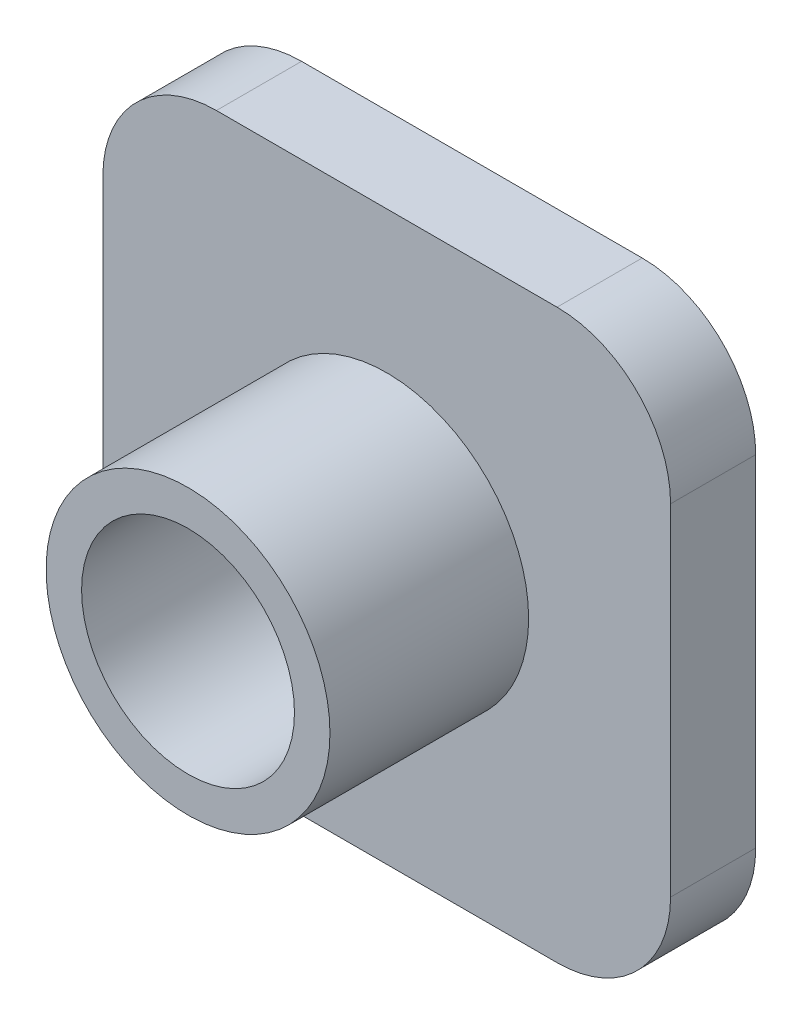
ISO-10303-21;
HEADER;
FILE_DESCRIPTION(('STEP AP214'),'2;1');
FILE_NAME('part.step','',(''),(''),'','','');
FILE_SCHEMA(('AUTOMOTIVE_DESIGN { 1 0 10303 214 1 1 1 1 }'));
ENDSEC;
DATA;
#1=APPLICATION_CONTEXT('core data for automotive mechanical design processes');
#2=APPLICATION_PROTOCOL_DEFINITION('international standard','automotive_design',2000,#1);
#3=PRODUCT_CONTEXT('',#1,'mechanical');
#4=PRODUCT('Part','Part','',(#3));
#5=PRODUCT_RELATED_PRODUCT_CATEGORY('part','',(#4));
#6=PRODUCT_DEFINITION_FORMATION('','',#4);
#7=PRODUCT_DEFINITION_CONTEXT('part definition',#1,'design');
#8=PRODUCT_DEFINITION('design','',#6,#7);
#9=PRODUCT_DEFINITION_SHAPE('','',#8);
#10=(LENGTH_UNIT() NAMED_UNIT(*) SI_UNIT(.MILLI.,.METRE.));
#11=(NAMED_UNIT(*) PLANE_ANGLE_UNIT() SI_UNIT($,.RADIAN.));
#12=(NAMED_UNIT(*) SI_UNIT($,.STERADIAN.) SOLID_ANGLE_UNIT());
#13=UNCERTAINTY_MEASURE_WITH_UNIT(LENGTH_MEASURE(1.E-05),#10,'distance_accuracy_value','');
#14=(GEOMETRIC_REPRESENTATION_CONTEXT(3) GLOBAL_UNCERTAINTY_ASSIGNED_CONTEXT((#13)) GLOBAL_UNIT_ASSIGNED_CONTEXT((#10,
#11,#12)) REPRESENTATION_CONTEXT('',''));
#15=CARTESIAN_POINT('',(0.,0.,0.));
#16=DIRECTION('',(0.,0.,1.));
#17=DIRECTION('',(1.,0.,0.));
#18=AXIS2_PLACEMENT_3D('',#15,#16,#17);
#19=CARTESIAN_POINT('',(-123.000000000001,-48.0000000000001,20.));
#20=DIRECTION('',(0.,0.,1.));
#21=DIRECTION('',(1.,0.,0.));
#22=AXIS2_PLACEMENT_3D('',#19,#20,#21);
#23=PLANE('',#22);
#24=CARTESIAN_POINT('',(-123.000000000001,-48.0000000000001,20.));
#25=DIRECTION('',(0.,0.,1.));
#26=DIRECTION('',(1.,0.,0.));
#27=AXIS2_PLACEMENT_3D('',#24,#25,#26);
#28=CIRCLE('',#27,9.99999999999999);
#29=CARTESIAN_POINT('',(-113.000000000001,-48.0000000000001,20.));
#30=VERTEX_POINT('',#29);
#31=EDGE_CURVE('E11',#30,#30,#28,.T.);
#32=ORIENTED_EDGE('',*,*,#31,.T.);
#33=EDGE_LOOP('',(#32));
#34=FACE_BOUND('',#33,.T.);
#35=CARTESIAN_POINT('',(-123.000000000001,-48.0000000000001,20.));
#36=DIRECTION('',(0.,0.,1.));
#37=DIRECTION('',(1.,0.,0.));
#38=AXIS2_PLACEMENT_3D('',#35,#36,#37);
#39=CIRCLE('',#38,7.5);
#40=CARTESIAN_POINT('',(-115.500000000001,-48.0000000000001,20.));
#41=VERTEX_POINT('',#40);
#42=EDGE_CURVE('E42',#41,#41,#39,.T.);
#43=ORIENTED_EDGE('',*,*,#42,.F.);
#44=EDGE_LOOP('',(#43));
#45=FACE_BOUND('',#44,.T.);
#46=ADVANCED_FACE('F33',(#34,#45),#23,.T.);
#47=CARTESIAN_POINT('',(-123.000000000001,-48.0000000000001,0.));
#48=DIRECTION('',(0.,0.,1.));
#49=DIRECTION('',(1.,0.,0.));
#50=AXIS2_PLACEMENT_3D('',#47,#48,#49);
#51=PLANE('',#50);
#52=CARTESIAN_POINT('',(-123.000000000001,-48.0000000000001,0.));
#53=DIRECTION('',(0.,0.,1.));
#54=DIRECTION('',(1.,0.,0.));
#55=AXIS2_PLACEMENT_3D('',#52,#53,#54);
#56=CIRCLE('',#55,7.5);
#57=CARTESIAN_POINT('',(-115.500000000001,-48.0000000000001,0.));
#58=VERTEX_POINT('',#57);
#59=EDGE_CURVE('E169',#58,#58,#56,.T.);
#60=ORIENTED_EDGE('',*,*,#59,.T.);
#61=EDGE_LOOP('',(#60));
#62=FACE_BOUND('',#61,.T.);
#63=CARTESIAN_POINT('',(-135.000000000001,-36.0000000000001,0.));
#64=DIRECTION('',(0.,0.,-1.));
#65=DIRECTION('',(1.,0.,0.));
#66=AXIS2_PLACEMENT_3D('',#63,#64,#65);
#67=CIRCLE('',#66,8.00000000000001);
#68=CARTESIAN_POINT('',(-143.000000000001,-36.0000000000001,0.));
#69=VERTEX_POINT('',#68);
#70=CARTESIAN_POINT('',(-135.000000000001,-28.0000000000001,0.));
#71=VERTEX_POINT('',#70);
#72=EDGE_CURVE('E134',#69,#71,#67,.T.);
#73=ORIENTED_EDGE('',*,*,#72,.T.);
#74=DIRECTION('',(1.,0.,0.));
#75=VECTOR('',#74,1.);
#76=CARTESIAN_POINT('',(-111.000000000001,-28.0000000000001,0.));
#77=LINE('',#76,#75);
#78=CARTESIAN_POINT('',(-111.000000000001,-28.0000000000001,0.));
#79=VERTEX_POINT('',#78);
#80=EDGE_CURVE('E137',#71,#79,#77,.T.);
#81=ORIENTED_EDGE('',*,*,#80,.T.);
#82=CARTESIAN_POINT('',(-111.000000000001,-36.0000000000001,0.));
#83=DIRECTION('',(0.,0.,-1.));
#84=DIRECTION('',(-1.,0.,0.));
#85=AXIS2_PLACEMENT_3D('',#82,#83,#84);
#86=CIRCLE('',#85,8.00000000000001);
#87=CARTESIAN_POINT('',(-103.000000000001,-36.0000000000001,0.));
#88=VERTEX_POINT('',#87);
#89=EDGE_CURVE('E140',#79,#88,#86,.T.);
#90=ORIENTED_EDGE('',*,*,#89,.T.);
#91=DIRECTION('',(0.,-1.,0.));
#92=VECTOR('',#91,1.);
#93=CARTESIAN_POINT('',(-103.000000000001,-36.0000000000001,0.));
#94=LINE('',#93,#92);
#95=CARTESIAN_POINT('',(-103.000000000001,-60.0000000000001,0.));
#96=VERTEX_POINT('',#95);
#97=EDGE_CURVE('E143',#88,#96,#94,.T.);
#98=ORIENTED_EDGE('',*,*,#97,.T.);
#99=CARTESIAN_POINT('',(-111.000000000001,-60.0000000000001,0.));
#100=DIRECTION('',(0.,0.,-1.));
#101=DIRECTION('',(-1.,0.,0.));
#102=AXIS2_PLACEMENT_3D('',#99,#100,#101);
#103=CIRCLE('',#102,7.99999999999999);
#104=CARTESIAN_POINT('',(-111.000000000001,-68.0000000000001,0.));
#105=VERTEX_POINT('',#104);
#106=EDGE_CURVE('E146',#96,#105,#103,.T.);
#107=ORIENTED_EDGE('',*,*,#106,.T.);
#108=DIRECTION('',(-1.,0.,0.));
#109=VECTOR('',#108,1.);
#110=CARTESIAN_POINT('',(-111.000000000001,-68.0000000000001,0.));
#111=LINE('',#110,#109);
#112=CARTESIAN_POINT('',(-135.000000000001,-68.0000000000001,0.));
#113=VERTEX_POINT('',#112);
#114=EDGE_CURVE('E149',#105,#113,#111,.T.);
#115=ORIENTED_EDGE('',*,*,#114,.T.);
#116=CARTESIAN_POINT('',(-135.000000000001,-60.0000000000001,0.));
#117=DIRECTION('',(0.,0.,-1.));
#118=DIRECTION('',(-1.,0.,0.));
#119=AXIS2_PLACEMENT_3D('',#116,#117,#118);
#120=CIRCLE('',#119,8.);
#121=CARTESIAN_POINT('',(-143.000000000001,-60.0000000000001,0.));
#122=VERTEX_POINT('',#121);
#123=EDGE_CURVE('E110',#113,#122,#120,.T.);
#124=ORIENTED_EDGE('',*,*,#123,.T.);
#125=DIRECTION('',(0.,1.,0.));
#126=VECTOR('',#125,1.);
#127=CARTESIAN_POINT('',(-143.000000000001,-36.0000000000001,0.));
#128=LINE('',#127,#126);
#129=EDGE_CURVE('E152',#122,#69,#128,.T.);
#130=ORIENTED_EDGE('',*,*,#129,.T.);
#131=EDGE_LOOP('',(#73,#81,#90,#98,#107,#115,#124,#130));
#132=FACE_BOUND('',#131,.T.);
#133=ADVANCED_FACE('F174',(#62,#132),#51,.F.);
#134=CARTESIAN_POINT('',(-123.000000000001,-48.0000000000001,20.));
#135=DIRECTION('',(0.,0.,-1.));
#136=DIRECTION('',(-1.,0.,0.));
#137=AXIS2_PLACEMENT_3D('',#134,#135,#136);
#138=CYLINDRICAL_SURFACE('',#137,9.99999999999999);
#139=CARTESIAN_POINT('',(-123.000000000001,-48.0000000000001,6.));
#140=DIRECTION('',(0.,0.,1.));
#141=DIRECTION('',(1.,0.,0.));
#142=AXIS2_PLACEMENT_3D('',#139,#140,#141);
#143=CIRCLE('',#142,9.99999999999999);
#144=CARTESIAN_POINT('',(-113.000000000001,-48.0000000000001,6.));
#145=VERTEX_POINT('',#144);
#146=EDGE_CURVE('E157',#145,#145,#143,.T.);
#147=ORIENTED_EDGE('',*,*,#146,.T.);
#148=EDGE_LOOP('',(#147));
#149=FACE_BOUND('',#148,.T.);
#150=ORIENTED_EDGE('',*,*,#31,.F.);
#151=EDGE_LOOP('',(#150));
#152=FACE_BOUND('',#151,.T.);
#153=ADVANCED_FACE('F35',(#149,#152),#138,.T.);
#154=CARTESIAN_POINT('',(-123.000000000001,-48.0000000000001,20.));
#155=DIRECTION('',(0.,0.,-1.));
#156=DIRECTION('',(-1.,0.,0.));
#157=AXIS2_PLACEMENT_3D('',#154,#155,#156);
#158=CYLINDRICAL_SURFACE('',#157,7.5);
#159=ORIENTED_EDGE('',*,*,#42,.T.);
#160=EDGE_LOOP('',(#159));
#161=FACE_BOUND('',#160,.T.);
#162=ORIENTED_EDGE('',*,*,#59,.F.);
#163=EDGE_LOOP('',(#162));
#164=FACE_BOUND('',#163,.T.);
#165=ADVANCED_FACE('F177',(#161,#164),#158,.F.);
#166=CARTESIAN_POINT('',(-135.000000000001,-36.0000000000001,6.));
#167=DIRECTION('',(0.,0.,1.));
#168=DIRECTION('',(1.,0.,0.));
#169=AXIS2_PLACEMENT_3D('',#166,#167,#168);
#170=PLANE('',#169);
#171=CARTESIAN_POINT('',(-135.000000000001,-36.0000000000001,6.));
#172=DIRECTION('',(0.,0.,-1.));
#173=DIRECTION('',(1.,0.,0.));
#174=AXIS2_PLACEMENT_3D('',#171,#172,#173);
#175=CIRCLE('',#174,8.00000000000001);
#176=CARTESIAN_POINT('',(-143.000000000001,-36.0000000000001,6.));
#177=VERTEX_POINT('',#176);
#178=CARTESIAN_POINT('',(-135.000000000001,-28.0000000000001,6.));
#179=VERTEX_POINT('',#178);
#180=EDGE_CURVE('E155',#177,#179,#175,.T.);
#181=ORIENTED_EDGE('',*,*,#180,.F.);
#182=DIRECTION('',(0.,1.,0.));
#183=VECTOR('',#182,1.);
#184=CARTESIAN_POINT('',(-143.000000000001,-36.0000000000001,6.));
#185=LINE('',#184,#183);
#186=CARTESIAN_POINT('',(-143.000000000001,-60.0000000000001,6.));
#187=VERTEX_POINT('',#186);
#188=EDGE_CURVE('E124',#187,#177,#185,.T.);
#189=ORIENTED_EDGE('',*,*,#188,.F.);
#190=CARTESIAN_POINT('',(-135.000000000001,-60.0000000000001,6.));
#191=DIRECTION('',(0.,0.,-1.));
#192=DIRECTION('',(-1.,0.,0.));
#193=AXIS2_PLACEMENT_3D('',#190,#191,#192);
#194=CIRCLE('',#193,8.);
#195=CARTESIAN_POINT('',(-135.000000000001,-68.0000000000001,6.));
#196=VERTEX_POINT('',#195);
#197=EDGE_CURVE('E108',#196,#187,#194,.T.);
#198=ORIENTED_EDGE('',*,*,#197,.F.);
#199=DIRECTION('',(-1.,0.,0.));
#200=VECTOR('',#199,1.);
#201=CARTESIAN_POINT('',(-111.000000000001,-68.0000000000001,6.));
#202=LINE('',#201,#200);
#203=CARTESIAN_POINT('',(-111.000000000001,-68.0000000000001,6.));
#204=VERTEX_POINT('',#203);
#205=EDGE_CURVE('E122',#204,#196,#202,.T.);
#206=ORIENTED_EDGE('',*,*,#205,.F.);
#207=CARTESIAN_POINT('',(-111.000000000001,-60.0000000000001,6.));
#208=DIRECTION('',(0.,0.,-1.));
#209=DIRECTION('',(-1.,0.,0.));
#210=AXIS2_PLACEMENT_3D('',#207,#208,#209);
#211=CIRCLE('',#210,7.99999999999999);
#212=CARTESIAN_POINT('',(-103.000000000001,-60.0000000000001,6.));
#213=VERTEX_POINT('',#212);
#214=EDGE_CURVE('E127',#213,#204,#211,.T.);
#215=ORIENTED_EDGE('',*,*,#214,.F.);
#216=DIRECTION('',(0.,-1.,0.));
#217=VECTOR('',#216,1.);
#218=CARTESIAN_POINT('',(-103.000000000001,-36.0000000000001,6.));
#219=LINE('',#218,#217);
#220=CARTESIAN_POINT('',(-103.000000000001,-36.0000000000001,6.));
#221=VERTEX_POINT('',#220);
#222=EDGE_CURVE('E129',#221,#213,#219,.T.);
#223=ORIENTED_EDGE('',*,*,#222,.F.);
#224=CARTESIAN_POINT('',(-111.000000000001,-36.0000000000001,6.));
#225=DIRECTION('',(0.,0.,-1.));
#226=DIRECTION('',(-1.,0.,0.));
#227=AXIS2_PLACEMENT_3D('',#224,#225,#226);
#228=CIRCLE('',#227,8.00000000000001);
#229=CARTESIAN_POINT('',(-111.000000000001,-28.0000000000001,6.));
#230=VERTEX_POINT('',#229);
#231=EDGE_CURVE('E294',#230,#221,#228,.T.);
#232=ORIENTED_EDGE('',*,*,#231,.F.);
#233=DIRECTION('',(1.,0.,0.));
#234=VECTOR('',#233,1.);
#235=CARTESIAN_POINT('',(-111.000000000001,-28.0000000000001,6.));
#236=LINE('',#235,#234);
#237=EDGE_CURVE('E292',#179,#230,#236,.T.);
#238=ORIENTED_EDGE('',*,*,#237,.F.);
#239=EDGE_LOOP('',(#181,#189,#198,#206,#215,#223,#232,#238));
#240=FACE_BOUND('',#239,.T.);
#241=ORIENTED_EDGE('',*,*,#146,.F.);
#242=EDGE_LOOP('',(#241));
#243=FACE_BOUND('',#242,.T.);
#244=ADVANCED_FACE('F119',(#240,#243),#170,.T.);
#245=CARTESIAN_POINT('',(-135.000000000001,-36.0000000000001,6.));
#246=DIRECTION('',(0.,0.,-1.));
#247=DIRECTION('',(-1.,0.,0.));
#248=AXIS2_PLACEMENT_3D('',#245,#246,#247);
#249=CYLINDRICAL_SURFACE('',#248,8.00000000000001);
#250=ORIENTED_EDGE('',*,*,#72,.F.);
#251=DIRECTION('',(0.,0.,-1.));
#252=VECTOR('',#251,1.);
#253=CARTESIAN_POINT('',(-143.000000000001,-36.0000000000001,6.));
#254=LINE('',#253,#252);
#255=EDGE_CURVE('E50',#177,#69,#254,.T.);
#256=ORIENTED_EDGE('',*,*,#255,.F.);
#257=ORIENTED_EDGE('',*,*,#180,.T.);
#258=DIRECTION('',(0.,0.,-1.));
#259=VECTOR('',#258,1.);
#260=CARTESIAN_POINT('',(-135.000000000001,-28.0000000000001,6.));
#261=LINE('',#260,#259);
#262=EDGE_CURVE('E91',#179,#71,#261,.T.);
#263=ORIENTED_EDGE('',*,*,#262,.T.);
#264=EDGE_LOOP('',(#250,#256,#257,#263));
#265=FACE_BOUND('',#264,.T.);
#266=ADVANCED_FACE('F185',(#265),#249,.T.);
#267=CARTESIAN_POINT('',(-143.000000000001,-36.0000000000001,6.));
#268=DIRECTION('',(-1.,0.,0.));
#269=DIRECTION('',(0.,0.,1.));
#270=AXIS2_PLACEMENT_3D('',#267,#268,#269);
#271=PLANE('',#270);
#272=ORIENTED_EDGE('',*,*,#129,.F.);
#273=DIRECTION('',(0.,0.,-1.));
#274=VECTOR('',#273,1.);
#275=CARTESIAN_POINT('',(-143.000000000001,-60.0000000000001,6.));
#276=LINE('',#275,#274);
#277=EDGE_CURVE('E79',#187,#122,#276,.T.);
#278=ORIENTED_EDGE('',*,*,#277,.F.);
#279=ORIENTED_EDGE('',*,*,#188,.T.);
#280=ORIENTED_EDGE('',*,*,#255,.T.);
#281=EDGE_LOOP('',(#272,#278,#279,#280));
#282=FACE_BOUND('',#281,.T.);
#283=ADVANCED_FACE('F225',(#282),#271,.T.);
#284=CARTESIAN_POINT('',(-135.000000000001,-60.0000000000001,6.));
#285=DIRECTION('',(0.,0.,-1.));
#286=DIRECTION('',(-1.,0.,0.));
#287=AXIS2_PLACEMENT_3D('',#284,#285,#286);
#288=CYLINDRICAL_SURFACE('',#287,8.);
#289=ORIENTED_EDGE('',*,*,#123,.F.);
#290=DIRECTION('',(0.,0.,-1.));
#291=VECTOR('',#290,1.);
#292=CARTESIAN_POINT('',(-135.000000000001,-68.0000000000001,6.));
#293=LINE('',#292,#291);
#294=EDGE_CURVE('E105',#196,#113,#293,.T.);
#295=ORIENTED_EDGE('',*,*,#294,.F.);
#296=ORIENTED_EDGE('',*,*,#197,.T.);
#297=ORIENTED_EDGE('',*,*,#277,.T.);
#298=EDGE_LOOP('',(#289,#295,#296,#297));
#299=FACE_BOUND('',#298,.T.);
#300=ADVANCED_FACE('F107',(#299),#288,.T.);
#301=CARTESIAN_POINT('',(-111.000000000001,-68.0000000000001,6.));
#302=DIRECTION('',(0.,-1.,0.));
#303=DIRECTION('',(0.,0.,-1.));
#304=AXIS2_PLACEMENT_3D('',#301,#302,#303);
#305=PLANE('',#304);
#306=ORIENTED_EDGE('',*,*,#114,.F.);
#307=DIRECTION('',(0.,0.,-1.));
#308=VECTOR('',#307,1.);
#309=CARTESIAN_POINT('',(-111.000000000001,-68.0000000000001,6.));
#310=LINE('',#309,#308);
#311=EDGE_CURVE('E115',#204,#105,#310,.T.);
#312=ORIENTED_EDGE('',*,*,#311,.F.);
#313=ORIENTED_EDGE('',*,*,#205,.T.);
#314=ORIENTED_EDGE('',*,*,#294,.T.);
#315=EDGE_LOOP('',(#306,#312,#313,#314));
#316=FACE_BOUND('',#315,.T.);
#317=ADVANCED_FACE('F126',(#316),#305,.T.);
#318=CARTESIAN_POINT('',(-111.000000000001,-60.0000000000001,6.));
#319=DIRECTION('',(0.,0.,-1.));
#320=DIRECTION('',(-1.,0.,0.));
#321=AXIS2_PLACEMENT_3D('',#318,#319,#320);
#322=CYLINDRICAL_SURFACE('',#321,7.99999999999999);
#323=ORIENTED_EDGE('',*,*,#106,.F.);
#324=DIRECTION('',(0.,0.,-1.));
#325=VECTOR('',#324,1.);
#326=CARTESIAN_POINT('',(-103.000000000001,-60.0000000000001,6.));
#327=LINE('',#326,#325);
#328=EDGE_CURVE('E160',#213,#96,#327,.T.);
#329=ORIENTED_EDGE('',*,*,#328,.F.);
#330=ORIENTED_EDGE('',*,*,#214,.T.);
#331=ORIENTED_EDGE('',*,*,#311,.T.);
#332=EDGE_LOOP('',(#323,#329,#330,#331));
#333=FACE_BOUND('',#332,.T.);
#334=ADVANCED_FACE('F249',(#333),#322,.T.);
#335=CARTESIAN_POINT('',(-103.000000000001,-36.0000000000001,6.));
#336=DIRECTION('',(1.,0.,0.));
#337=DIRECTION('',(0.,1.,0.));
#338=AXIS2_PLACEMENT_3D('',#335,#336,#337);
#339=PLANE('',#338);
#340=ORIENTED_EDGE('',*,*,#97,.F.);
#341=DIRECTION('',(0.,0.,-1.));
#342=VECTOR('',#341,1.);
#343=CARTESIAN_POINT('',(-103.000000000001,-36.0000000000001,6.));
#344=LINE('',#343,#342);
#345=EDGE_CURVE('E162',#221,#88,#344,.T.);
#346=ORIENTED_EDGE('',*,*,#345,.F.);
#347=ORIENTED_EDGE('',*,*,#222,.T.);
#348=ORIENTED_EDGE('',*,*,#328,.T.);
#349=EDGE_LOOP('',(#340,#346,#347,#348));
#350=FACE_BOUND('',#349,.T.);
#351=ADVANCED_FACE('F258',(#350),#339,.T.);
#352=CARTESIAN_POINT('',(-111.000000000001,-36.0000000000001,6.));
#353=DIRECTION('',(0.,0.,-1.));
#354=DIRECTION('',(-1.,0.,0.));
#355=AXIS2_PLACEMENT_3D('',#352,#353,#354);
#356=CYLINDRICAL_SURFACE('',#355,8.00000000000001);
#357=ORIENTED_EDGE('',*,*,#89,.F.);
#358=DIRECTION('',(0.,0.,-1.));
#359=VECTOR('',#358,1.);
#360=CARTESIAN_POINT('',(-111.000000000001,-28.0000000000001,6.));
#361=LINE('',#360,#359);
#362=EDGE_CURVE('E164',#230,#79,#361,.T.);
#363=ORIENTED_EDGE('',*,*,#362,.F.);
#364=ORIENTED_EDGE('',*,*,#231,.T.);
#365=ORIENTED_EDGE('',*,*,#345,.T.);
#366=EDGE_LOOP('',(#357,#363,#364,#365));
#367=FACE_BOUND('',#366,.T.);
#368=ADVANCED_FACE('F268',(#367),#356,.T.);
#369=CARTESIAN_POINT('',(-111.000000000001,-28.0000000000001,6.));
#370=DIRECTION('',(0.,1.,0.));
#371=DIRECTION('',(0.,0.,1.));
#372=AXIS2_PLACEMENT_3D('',#369,#370,#371);
#373=PLANE('',#372);
#374=ORIENTED_EDGE('',*,*,#80,.F.);
#375=ORIENTED_EDGE('',*,*,#262,.F.);
#376=ORIENTED_EDGE('',*,*,#237,.T.);
#377=ORIENTED_EDGE('',*,*,#362,.T.);
#378=EDGE_LOOP('',(#374,#375,#376,#377));
#379=FACE_BOUND('',#378,.T.);
#380=ADVANCED_FACE('F278',(#379),#373,.T.);
#381=CLOSED_SHELL('',(#46,#133,#153,#165,#244,#266,#283,#300,#317,#334,#351,#368,#380));
#382=MANIFOLD_SOLID_BREP('B2',#381);
#383=ADVANCED_BREP_SHAPE_REPRESENTATION('',(#18,#382),#14);
#384=SHAPE_DEFINITION_REPRESENTATION(#9,#383);
ENDSEC;
END-ISO-10303-21;
